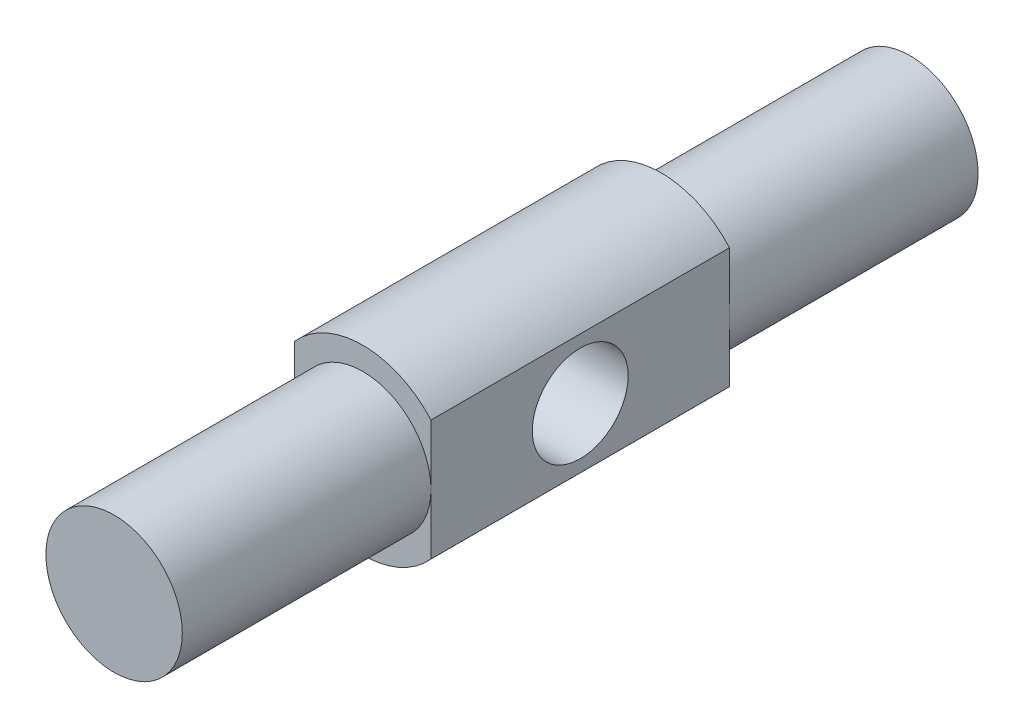
ISO-10303-21;
HEADER;
FILE_DESCRIPTION(('STEP AP214'),'2;1');
FILE_NAME('part.step','',(''),(''),'','','');
FILE_SCHEMA(('AUTOMOTIVE_DESIGN { 1 0 10303 214 1 1 1 1 }'));
ENDSEC;
DATA;
#1=APPLICATION_CONTEXT('core data for automotive mechanical design processes');
#2=APPLICATION_PROTOCOL_DEFINITION('international standard','automotive_design',2000,#1);
#3=PRODUCT_CONTEXT('',#1,'mechanical');
#4=PRODUCT('Part','Part','',(#3));
#5=PRODUCT_RELATED_PRODUCT_CATEGORY('part','',(#4));
#6=PRODUCT_DEFINITION_FORMATION('','',#4);
#7=PRODUCT_DEFINITION_CONTEXT('part definition',#1,'design');
#8=PRODUCT_DEFINITION('design','',#6,#7);
#9=PRODUCT_DEFINITION_SHAPE('','',#8);
#10=(LENGTH_UNIT() NAMED_UNIT(*) SI_UNIT(.MILLI.,.METRE.));
#11=(NAMED_UNIT(*) PLANE_ANGLE_UNIT() SI_UNIT($,.RADIAN.));
#12=(NAMED_UNIT(*) SI_UNIT($,.STERADIAN.) SOLID_ANGLE_UNIT());
#13=UNCERTAINTY_MEASURE_WITH_UNIT(LENGTH_MEASURE(1.E-05),#10,'distance_accuracy_value','');
#14=(GEOMETRIC_REPRESENTATION_CONTEXT(3) GLOBAL_UNCERTAINTY_ASSIGNED_CONTEXT((#13)) GLOBAL_UNIT_ASSIGNED_CONTEXT((#10,
#11,#12)) REPRESENTATION_CONTEXT('',''));
#15=CARTESIAN_POINT('',(0.,0.,0.));
#16=DIRECTION('',(0.,0.,1.));
#17=DIRECTION('',(1.,0.,0.));
#18=AXIS2_PLACEMENT_3D('',#15,#16,#17);
#19=CARTESIAN_POINT('',(0.,0.,-70.));
#20=DIRECTION('',(0.,0.,1.));
#21=DIRECTION('',(1.,0.,0.));
#22=AXIS2_PLACEMENT_3D('',#19,#20,#21);
#23=PLANE('',#22);
#24=CARTESIAN_POINT('',(0.,0.,-70.));
#25=DIRECTION('',(0.,0.,-1.));
#26=DIRECTION('',(-1.,0.,0.));
#27=AXIS2_PLACEMENT_3D('',#24,#25,#26);
#28=CIRCLE('',#27,6.);
#29=CARTESIAN_POINT('',(-6.,0.,-70.));
#30=VERTEX_POINT('',#29);
#31=EDGE_CURVE('E124',#30,#30,#28,.T.);
#32=ORIENTED_EDGE('',*,*,#31,.T.);
#33=EDGE_LOOP('',(#32));
#34=FACE_BOUND('',#33,.T.);
#35=ADVANCED_FACE('F45',(#34),#23,.F.);
#36=CARTESIAN_POINT('',(6.,0.,-70.));
#37=DIRECTION('',(1.,0.,0.));
#38=DIRECTION('',(0.,0.,-1.));
#39=AXIS2_PLACEMENT_3D('',#36,#37,#38);
#40=PLANE('',#39);
#41=CARTESIAN_POINT('',(6.,0.,-35.));
#42=DIRECTION('',(1.,0.,0.));
#43=DIRECTION('',(0.,0.,-1.));
#44=AXIS2_PLACEMENT_3D('',#41,#42,#43);
#45=CIRCLE('',#44,4.215);
#46=CARTESIAN_POINT('',(6.,0.,-39.215));
#47=VERTEX_POINT('',#46);
#48=EDGE_CURVE('E311',#47,#47,#45,.T.);
#49=ORIENTED_EDGE('',*,*,#48,.F.);
#50=EDGE_LOOP('',(#49));
#51=FACE_BOUND('',#50,.T.);
#52=DIRECTION('',(0.,0.,1.));
#53=VECTOR('',#52,1.);
#54=CARTESIAN_POINT('',(6.,-5.29150262212918,-70.));
#55=LINE('',#54,#53);
#56=CARTESIAN_POINT('',(6.,-5.29150262212918,-48.125));
#57=VERTEX_POINT('',#56);
#58=CARTESIAN_POINT('',(6.,-5.29150262212918,-21.875));
#59=VERTEX_POINT('',#58);
#60=EDGE_CURVE('E11',#57,#59,#55,.T.);
#61=ORIENTED_EDGE('',*,*,#60,.F.);
#62=DIRECTION('',(0.,-1.,0.));
#63=VECTOR('',#62,1.);
#64=CARTESIAN_POINT('',(6.,0.,-48.125));
#65=LINE('',#64,#63);
#66=CARTESIAN_POINT('',(6.,0.,-48.125));
#67=VERTEX_POINT('',#66);
#68=EDGE_CURVE('E104',#67,#57,#65,.T.);
#69=ORIENTED_EDGE('',*,*,#68,.F.);
#70=DIRECTION('',(0.,-1.,0.));
#71=VECTOR('',#70,1.);
#72=CARTESIAN_POINT('',(6.,0.,-48.125));
#73=LINE('',#72,#71);
#74=CARTESIAN_POINT('',(6.,5.29150262212918,-48.125));
#75=VERTEX_POINT('',#74);
#76=EDGE_CURVE('E115',#75,#67,#73,.T.);
#77=ORIENTED_EDGE('',*,*,#76,.F.);
#78=DIRECTION('',(0.,0.,1.));
#79=VECTOR('',#78,1.);
#80=CARTESIAN_POINT('',(6.,5.29150262212918,-70.));
#81=LINE('',#80,#79);
#82=CARTESIAN_POINT('',(6.,5.29150262212918,-21.875));
#83=VERTEX_POINT('',#82);
#84=EDGE_CURVE('E49',#75,#83,#81,.T.);
#85=ORIENTED_EDGE('',*,*,#84,.T.);
#86=DIRECTION('',(0.,1.,0.));
#87=VECTOR('',#86,1.);
#88=CARTESIAN_POINT('',(6.,0.,-21.875));
#89=LINE('',#88,#87);
#90=CARTESIAN_POINT('',(6.,0.,-21.875));
#91=VERTEX_POINT('',#90);
#92=EDGE_CURVE('E149',#91,#83,#89,.T.);
#93=ORIENTED_EDGE('',*,*,#92,.F.);
#94=DIRECTION('',(0.,1.,0.));
#95=VECTOR('',#94,1.);
#96=CARTESIAN_POINT('',(6.,0.,-21.875));
#97=LINE('',#96,#95);
#98=EDGE_CURVE('E142',#59,#91,#97,.T.);
#99=ORIENTED_EDGE('',*,*,#98,.F.);
#100=EDGE_LOOP('',(#61,#69,#77,#85,#93,#99));
#101=FACE_BOUND('',#100,.T.);
#102=ADVANCED_FACE('F47',(#51,#101),#40,.T.);
#103=CARTESIAN_POINT('',(-6.,0.,-70.));
#104=DIRECTION('',(1.,0.,0.));
#105=DIRECTION('',(0.,0.,-1.));
#106=AXIS2_PLACEMENT_3D('',#103,#104,#105);
#107=PLANE('',#106);
#108=CARTESIAN_POINT('',(-6.,0.,-35.));
#109=DIRECTION('',(1.,0.,0.));
#110=DIRECTION('',(0.,0.,-1.));
#111=AXIS2_PLACEMENT_3D('',#108,#109,#110);
#112=CIRCLE('',#111,4.215);
#113=CARTESIAN_POINT('',(-6.,0.,-39.215));
#114=VERTEX_POINT('',#113);
#115=EDGE_CURVE('E111',#114,#114,#112,.T.);
#116=ORIENTED_EDGE('',*,*,#115,.T.);
#117=EDGE_LOOP('',(#116));
#118=FACE_BOUND('',#117,.T.);
#119=DIRECTION('',(0.,1.,0.));
#120=VECTOR('',#119,1.);
#121=CARTESIAN_POINT('',(-6.,0.,-48.125));
#122=LINE('',#121,#120);
#123=CARTESIAN_POINT('',(-6.,-5.29150262212918,-48.125));
#124=VERTEX_POINT('',#123);
#125=CARTESIAN_POINT('',(-6.,0.,-48.125));
#126=VERTEX_POINT('',#125);
#127=EDGE_CURVE('E107',#124,#126,#122,.T.);
#128=ORIENTED_EDGE('',*,*,#127,.F.);
#129=DIRECTION('',(0.,0.,1.));
#130=VECTOR('',#129,1.);
#131=CARTESIAN_POINT('',(-6.,-5.29150262212918,-70.));
#132=LINE('',#131,#130);
#133=CARTESIAN_POINT('',(-6.,-5.29150262212918,-21.875));
#134=VERTEX_POINT('',#133);
#135=EDGE_CURVE('E54',#124,#134,#132,.T.);
#136=ORIENTED_EDGE('',*,*,#135,.T.);
#137=DIRECTION('',(0.,-1.,0.));
#138=VECTOR('',#137,1.);
#139=CARTESIAN_POINT('',(-6.,0.,-21.875));
#140=LINE('',#139,#138);
#141=CARTESIAN_POINT('',(-6.,0.,-21.875));
#142=VERTEX_POINT('',#141);
#143=EDGE_CURVE('E130',#142,#134,#140,.T.);
#144=ORIENTED_EDGE('',*,*,#143,.F.);
#145=DIRECTION('',(0.,-1.,0.));
#146=VECTOR('',#145,1.);
#147=CARTESIAN_POINT('',(-6.,0.,-21.875));
#148=LINE('',#147,#146);
#149=CARTESIAN_POINT('',(-6.,5.29150262212918,-21.875));
#150=VERTEX_POINT('',#149);
#151=EDGE_CURVE('E153',#150,#142,#148,.T.);
#152=ORIENTED_EDGE('',*,*,#151,.F.);
#153=DIRECTION('',(0.,0.,1.));
#154=VECTOR('',#153,1.);
#155=CARTESIAN_POINT('',(-6.,5.29150262212918,-70.));
#156=LINE('',#155,#154);
#157=CARTESIAN_POINT('',(-6.,5.29150262212918,-48.125));
#158=VERTEX_POINT('',#157);
#159=EDGE_CURVE('E62',#158,#150,#156,.T.);
#160=ORIENTED_EDGE('',*,*,#159,.F.);
#161=DIRECTION('',(0.,1.,0.));
#162=VECTOR('',#161,1.);
#163=CARTESIAN_POINT('',(-6.,0.,-48.125));
#164=LINE('',#163,#162);
#165=EDGE_CURVE('E123',#126,#158,#164,.T.);
#166=ORIENTED_EDGE('',*,*,#165,.F.);
#167=EDGE_LOOP('',(#128,#136,#144,#152,#160,#166));
#168=FACE_BOUND('',#167,.T.);
#169=ADVANCED_FACE('F161',(#118,#168),#107,.F.);
#170=CARTESIAN_POINT('',(0.,0.,-70.));
#171=DIRECTION('',(0.,0.,1.));
#172=DIRECTION('',(1.,0.,0.));
#173=AXIS2_PLACEMENT_3D('',#170,#171,#172);
#174=CYLINDRICAL_SURFACE('',#173,8.);
#175=ORIENTED_EDGE('',*,*,#135,.F.);
#176=CARTESIAN_POINT('',(0.,0.,-48.125));
#177=DIRECTION('',(0.,0.,-1.));
#178=DIRECTION('',(-1.,0.,0.));
#179=AXIS2_PLACEMENT_3D('',#176,#177,#178);
#180=CIRCLE('',#179,8.);
#181=EDGE_CURVE('E117',#57,#124,#180,.T.);
#182=ORIENTED_EDGE('',*,*,#181,.F.);
#183=ORIENTED_EDGE('',*,*,#60,.T.);
#184=CARTESIAN_POINT('',(0.,0.,-21.875));
#185=DIRECTION('',(0.,0.,1.));
#186=DIRECTION('',(1.,0.,0.));
#187=AXIS2_PLACEMENT_3D('',#184,#185,#186);
#188=CIRCLE('',#187,8.);
#189=EDGE_CURVE('E139',#134,#59,#188,.T.);
#190=ORIENTED_EDGE('',*,*,#189,.F.);
#191=EDGE_LOOP('',(#175,#182,#183,#190));
#192=FACE_BOUND('',#191,.T.);
#193=ADVANCED_FACE('F167',(#192),#174,.T.);
#194=CARTESIAN_POINT('',(0.,0.,-70.));
#195=DIRECTION('',(0.,0.,1.));
#196=DIRECTION('',(1.,0.,0.));
#197=AXIS2_PLACEMENT_3D('',#194,#195,#196);
#198=CYLINDRICAL_SURFACE('',#197,8.);
#199=ORIENTED_EDGE('',*,*,#84,.F.);
#200=CARTESIAN_POINT('',(0.,0.,-48.125));
#201=DIRECTION('',(0.,0.,-1.));
#202=DIRECTION('',(-1.,0.,0.));
#203=AXIS2_PLACEMENT_3D('',#200,#201,#202);
#204=CIRCLE('',#203,8.);
#205=EDGE_CURVE('E127',#158,#75,#204,.T.);
#206=ORIENTED_EDGE('',*,*,#205,.F.);
#207=ORIENTED_EDGE('',*,*,#159,.T.);
#208=CARTESIAN_POINT('',(0.,0.,-21.875));
#209=DIRECTION('',(0.,0.,1.));
#210=DIRECTION('',(1.,0.,0.));
#211=AXIS2_PLACEMENT_3D('',#208,#209,#210);
#212=CIRCLE('',#211,8.);
#213=EDGE_CURVE('E151',#83,#150,#212,.T.);
#214=ORIENTED_EDGE('',*,*,#213,.F.);
#215=EDGE_LOOP('',(#199,#206,#207,#214));
#216=FACE_BOUND('',#215,.T.);
#217=ADVANCED_FACE('F170',(#216),#198,.T.);
#218=CARTESIAN_POINT('',(0.,0.,0.));
#219=DIRECTION('',(0.,0.,1.));
#220=DIRECTION('',(1.,0.,0.));
#221=AXIS2_PLACEMENT_3D('',#218,#219,#220);
#222=PLANE('',#221);
#223=CARTESIAN_POINT('',(0.,0.,0.));
#224=DIRECTION('',(0.,0.,1.));
#225=DIRECTION('',(1.,0.,0.));
#226=AXIS2_PLACEMENT_3D('',#223,#224,#225);
#227=CIRCLE('',#226,6.);
#228=CARTESIAN_POINT('',(6.,0.,0.));
#229=VERTEX_POINT('',#228);
#230=EDGE_CURVE('E145',#229,#229,#227,.T.);
#231=ORIENTED_EDGE('',*,*,#230,.T.);
#232=EDGE_LOOP('',(#231));
#233=FACE_BOUND('',#232,.T.);
#234=ADVANCED_FACE('F177',(#233),#222,.T.);
#235=CARTESIAN_POINT('',(0.,0.,-21.875));
#236=DIRECTION('',(0.,0.,1.));
#237=DIRECTION('',(1.,0.,0.));
#238=AXIS2_PLACEMENT_3D('',#235,#236,#237);
#239=CYLINDRICAL_SURFACE('',#238,6.);
#240=ORIENTED_EDGE('',*,*,#230,.F.);
#241=EDGE_LOOP('',(#240));
#242=FACE_BOUND('',#241,.T.);
#243=CARTESIAN_POINT('',(0.,0.,-21.875));
#244=DIRECTION('',(0.,0.,1.));
#245=DIRECTION('',(1.,0.,0.));
#246=AXIS2_PLACEMENT_3D('',#243,#244,#245);
#247=CIRCLE('',#246,6.);
#248=EDGE_CURVE('E128',#142,#91,#247,.T.);
#249=ORIENTED_EDGE('',*,*,#248,.T.);
#250=CARTESIAN_POINT('',(0.,0.,-21.875));
#251=DIRECTION('',(0.,0.,1.));
#252=DIRECTION('',(1.,0.,0.));
#253=AXIS2_PLACEMENT_3D('',#250,#251,#252);
#254=CIRCLE('',#253,6.);
#255=EDGE_CURVE('E146',#91,#142,#254,.T.);
#256=ORIENTED_EDGE('',*,*,#255,.T.);
#257=EDGE_LOOP('',(#249,#256));
#258=FACE_BOUND('',#257,.T.);
#259=ADVANCED_FACE('F175',(#242,#258),#239,.T.);
#260=CARTESIAN_POINT('',(0.,0.,-21.875));
#261=DIRECTION('',(0.,0.,1.));
#262=DIRECTION('',(1.,0.,0.));
#263=AXIS2_PLACEMENT_3D('',#260,#261,#262);
#264=PLANE('',#263);
#265=ORIENTED_EDGE('',*,*,#255,.F.);
#266=ORIENTED_EDGE('',*,*,#92,.T.);
#267=ORIENTED_EDGE('',*,*,#213,.T.);
#268=ORIENTED_EDGE('',*,*,#151,.T.);
#269=EDGE_LOOP('',(#265,#266,#267,#268));
#270=FACE_BOUND('',#269,.T.);
#271=ADVANCED_FACE('F173',(#270),#264,.T.);
#272=CARTESIAN_POINT('',(0.,0.,-21.875));
#273=DIRECTION('',(0.,0.,1.));
#274=DIRECTION('',(1.,0.,0.));
#275=AXIS2_PLACEMENT_3D('',#272,#273,#274);
#276=PLANE('',#275);
#277=ORIENTED_EDGE('',*,*,#248,.F.);
#278=ORIENTED_EDGE('',*,*,#143,.T.);
#279=ORIENTED_EDGE('',*,*,#189,.T.);
#280=ORIENTED_EDGE('',*,*,#98,.T.);
#281=EDGE_LOOP('',(#277,#278,#279,#280));
#282=FACE_BOUND('',#281,.T.);
#283=ADVANCED_FACE('F166',(#282),#276,.T.);
#284=CARTESIAN_POINT('',(0.,0.,-48.125));
#285=DIRECTION('',(0.,0.,-1.));
#286=DIRECTION('',(-1.,0.,0.));
#287=AXIS2_PLACEMENT_3D('',#284,#285,#286);
#288=CYLINDRICAL_SURFACE('',#287,6.);
#289=ORIENTED_EDGE('',*,*,#31,.F.);
#290=EDGE_LOOP('',(#289));
#291=FACE_BOUND('',#290,.T.);
#292=CARTESIAN_POINT('',(0.,0.,-48.125));
#293=DIRECTION('',(0.,0.,-1.));
#294=DIRECTION('',(-1.,0.,0.));
#295=AXIS2_PLACEMENT_3D('',#292,#293,#294);
#296=CIRCLE('',#295,6.);
#297=EDGE_CURVE('E101',#67,#126,#296,.T.);
#298=ORIENTED_EDGE('',*,*,#297,.T.);
#299=CARTESIAN_POINT('',(0.,0.,-48.125));
#300=DIRECTION('',(0.,0.,-1.));
#301=DIRECTION('',(-1.,0.,0.));
#302=AXIS2_PLACEMENT_3D('',#299,#300,#301);
#303=CIRCLE('',#302,6.);
#304=EDGE_CURVE('E119',#126,#67,#303,.T.);
#305=ORIENTED_EDGE('',*,*,#304,.T.);
#306=EDGE_LOOP('',(#298,#305));
#307=FACE_BOUND('',#306,.T.);
#308=ADVANCED_FACE('F120',(#291,#307),#288,.T.);
#309=CARTESIAN_POINT('',(0.,0.,-48.125));
#310=DIRECTION('',(0.,0.,-1.));
#311=DIRECTION('',(-1.,0.,0.));
#312=AXIS2_PLACEMENT_3D('',#309,#310,#311);
#313=PLANE('',#312);
#314=ORIENTED_EDGE('',*,*,#304,.F.);
#315=ORIENTED_EDGE('',*,*,#165,.T.);
#316=ORIENTED_EDGE('',*,*,#205,.T.);
#317=ORIENTED_EDGE('',*,*,#76,.T.);
#318=EDGE_LOOP('',(#314,#315,#316,#317));
#319=FACE_BOUND('',#318,.T.);
#320=ADVANCED_FACE('F126',(#319),#313,.T.);
#321=CARTESIAN_POINT('',(0.,0.,-48.125));
#322=DIRECTION('',(0.,0.,-1.));
#323=DIRECTION('',(-1.,0.,0.));
#324=AXIS2_PLACEMENT_3D('',#321,#322,#323);
#325=PLANE('',#324);
#326=ORIENTED_EDGE('',*,*,#297,.F.);
#327=ORIENTED_EDGE('',*,*,#68,.T.);
#328=ORIENTED_EDGE('',*,*,#181,.T.);
#329=ORIENTED_EDGE('',*,*,#127,.T.);
#330=EDGE_LOOP('',(#326,#327,#328,#329));
#331=FACE_BOUND('',#330,.T.);
#332=ADVANCED_FACE('F103',(#331),#325,.T.);
#333=CARTESIAN_POINT('',(-6.,0.,-35.));
#334=DIRECTION('',(1.,0.,0.));
#335=DIRECTION('',(0.,0.,-1.));
#336=AXIS2_PLACEMENT_3D('',#333,#334,#335);
#337=CYLINDRICAL_SURFACE('',#336,4.215);
#338=ORIENTED_EDGE('',*,*,#115,.F.);
#339=EDGE_LOOP('',(#338));
#340=FACE_BOUND('',#339,.T.);
#341=ORIENTED_EDGE('',*,*,#48,.T.);
#342=EDGE_LOOP('',(#341));
#343=FACE_BOUND('',#342,.T.);
#344=ADVANCED_FACE('F228',(#340,#343),#337,.F.);
#345=CLOSED_SHELL('',(#35,#102,#169,#193,#217,#234,#259,#271,#283,#308,#320,#332,#344));
#346=MANIFOLD_SOLID_BREP('B2',#345);
#347=ADVANCED_BREP_SHAPE_REPRESENTATION('',(#18,#346),#14);
#348=SHAPE_DEFINITION_REPRESENTATION(#9,#347);
ENDSEC;
END-ISO-10303-21;
